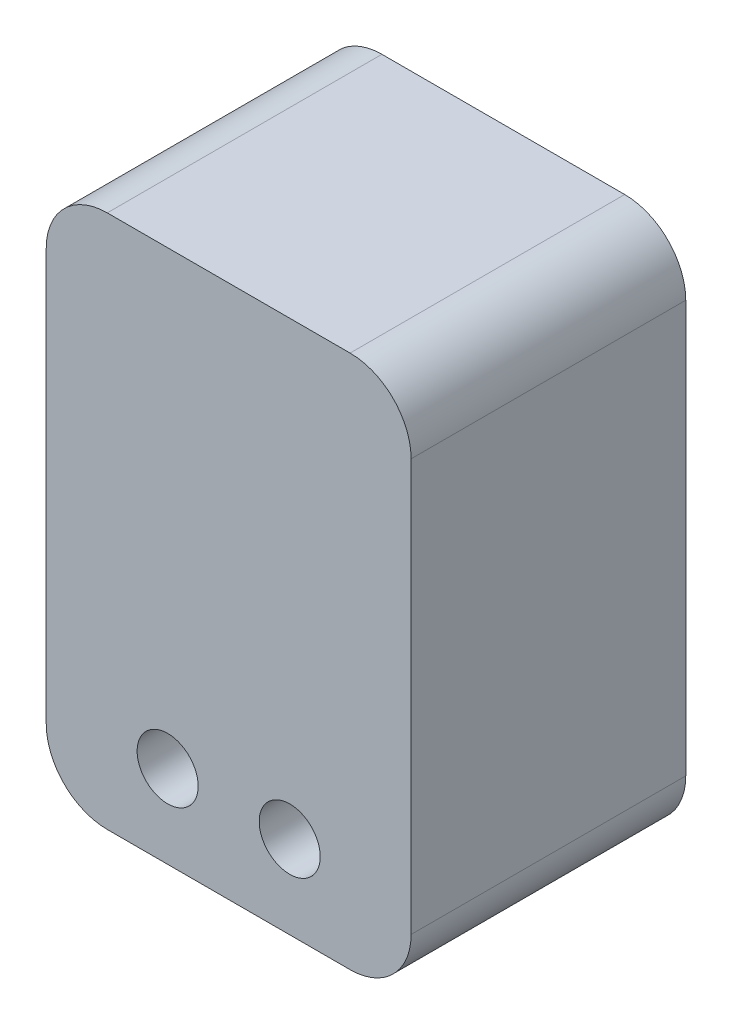
ISO-10303-21;
HEADER;
FILE_DESCRIPTION(('STEP AP214'),'2;1');
FILE_NAME('part.step','',(''),(''),'','','');
FILE_SCHEMA(('AUTOMOTIVE_DESIGN { 1 0 10303 214 1 1 1 1 }'));
ENDSEC;
DATA;
#1=APPLICATION_CONTEXT('core data for automotive mechanical design processes');
#2=APPLICATION_PROTOCOL_DEFINITION('international standard','automotive_design',2000,#1);
#3=PRODUCT_CONTEXT('',#1,'mechanical');
#4=PRODUCT('Part','Part','',(#3));
#5=PRODUCT_RELATED_PRODUCT_CATEGORY('part','',(#4));
#6=PRODUCT_DEFINITION_FORMATION('','',#4);
#7=PRODUCT_DEFINITION_CONTEXT('part definition',#1,'design');
#8=PRODUCT_DEFINITION('design','',#6,#7);
#9=PRODUCT_DEFINITION_SHAPE('','',#8);
#10=(LENGTH_UNIT() NAMED_UNIT(*) SI_UNIT(.MILLI.,.METRE.));
#11=(NAMED_UNIT(*) PLANE_ANGLE_UNIT() SI_UNIT($,.RADIAN.));
#12=(NAMED_UNIT(*) SI_UNIT($,.STERADIAN.) SOLID_ANGLE_UNIT());
#13=UNCERTAINTY_MEASURE_WITH_UNIT(LENGTH_MEASURE(1.E-05),#10,'distance_accuracy_value','');
#14=(GEOMETRIC_REPRESENTATION_CONTEXT(3) GLOBAL_UNCERTAINTY_ASSIGNED_CONTEXT((#13)) GLOBAL_UNIT_ASSIGNED_CONTEXT((#10,
#11,#12)) REPRESENTATION_CONTEXT('',''));
#15=CARTESIAN_POINT('',(0.,0.,0.));
#16=DIRECTION('',(0.,0.,1.));
#17=DIRECTION('',(1.,0.,0.));
#18=AXIS2_PLACEMENT_3D('',#15,#16,#17);
#19=CARTESIAN_POINT('',(0.,0.,9.));
#20=DIRECTION('',(0.,0.,1.));
#21=DIRECTION('',(1.,0.,0.));
#22=AXIS2_PLACEMENT_3D('',#19,#20,#21);
#23=PLANE('',#22);
#24=CARTESIAN_POINT('',(-2.,-6.03236787400678,9.));
#25=DIRECTION('',(0.,0.,1.));
#26=DIRECTION('',(1.,0.,0.));
#27=AXIS2_PLACEMENT_3D('',#24,#25,#26);
#28=CIRCLE('',#27,1.);
#29=CARTESIAN_POINT('',(-1.,-6.03236787400678,9.));
#30=VERTEX_POINT('',#29);
#31=EDGE_CURVE('E151',#30,#30,#28,.T.);
#32=ORIENTED_EDGE('',*,*,#31,.F.);
#33=EDGE_LOOP('',(#32));
#34=FACE_BOUND('',#33,.T.);
#35=DIRECTION('',(0.,1.,0.));
#36=VECTOR('',#35,1.);
#37=CARTESIAN_POINT('',(5.97879067718509,8.75,9.));
#38=LINE('',#37,#36);
#39=CARTESIAN_POINT('',(5.97879067718509,-6.75,9.));
#40=VERTEX_POINT('',#39);
#41=CARTESIAN_POINT('',(5.97879067718509,6.75,9.));
#42=VERTEX_POINT('',#41);
#43=EDGE_CURVE('E157',#40,#42,#38,.T.);
#44=ORIENTED_EDGE('',*,*,#43,.T.);
#45=CARTESIAN_POINT('',(3.97879067718509,6.75,9.));
#46=DIRECTION('',(0.,0.,1.));
#47=DIRECTION('',(1.,0.,0.));
#48=AXIS2_PLACEMENT_3D('',#45,#46,#47);
#49=CIRCLE('',#48,2.);
#50=CARTESIAN_POINT('',(3.97879067718509,8.75,9.));
#51=VERTEX_POINT('',#50);
#52=EDGE_CURVE('E181',#42,#51,#49,.T.);
#53=ORIENTED_EDGE('',*,*,#52,.T.);
#54=DIRECTION('',(-1.,0.,0.));
#55=VECTOR('',#54,1.);
#56=CARTESIAN_POINT('',(-5.97879067718509,8.75,9.));
#57=LINE('',#56,#55);
#58=CARTESIAN_POINT('',(-3.97879067718509,8.75,9.));
#59=VERTEX_POINT('',#58);
#60=EDGE_CURVE('E134',#51,#59,#57,.T.);
#61=ORIENTED_EDGE('',*,*,#60,.T.);
#62=CARTESIAN_POINT('',(-3.97879067718509,6.75,9.));
#63=DIRECTION('',(0.,0.,1.));
#64=DIRECTION('',(1.,0.,0.));
#65=AXIS2_PLACEMENT_3D('',#62,#63,#64);
#66=CIRCLE('',#65,2.);
#67=CARTESIAN_POINT('',(-5.97879067718509,6.75,9.));
#68=VERTEX_POINT('',#67);
#69=EDGE_CURVE('E173',#59,#68,#66,.T.);
#70=ORIENTED_EDGE('',*,*,#69,.T.);
#71=DIRECTION('',(0.,-1.,0.));
#72=VECTOR('',#71,1.);
#73=CARTESIAN_POINT('',(-5.97879067718509,8.75,9.));
#74=LINE('',#73,#72);
#75=CARTESIAN_POINT('',(-5.97879067718509,-6.75,9.));
#76=VERTEX_POINT('',#75);
#77=EDGE_CURVE('E196',#68,#76,#74,.T.);
#78=ORIENTED_EDGE('',*,*,#77,.T.);
#79=CARTESIAN_POINT('',(-3.97879067718509,-6.75,9.));
#80=DIRECTION('',(0.,0.,1.));
#81=DIRECTION('',(1.,0.,0.));
#82=AXIS2_PLACEMENT_3D('',#79,#80,#81);
#83=CIRCLE('',#82,2.);
#84=CARTESIAN_POINT('',(-3.97879067718509,-8.75,9.));
#85=VERTEX_POINT('',#84);
#86=EDGE_CURVE('E69',#76,#85,#83,.T.);
#87=ORIENTED_EDGE('',*,*,#86,.T.);
#88=DIRECTION('',(1.,0.,0.));
#89=VECTOR('',#88,1.);
#90=CARTESIAN_POINT('',(-5.97879067718509,-8.75,9.));
#91=LINE('',#90,#89);
#92=CARTESIAN_POINT('',(3.97879067718509,-8.75,9.));
#93=VERTEX_POINT('',#92);
#94=EDGE_CURVE('E159',#85,#93,#91,.T.);
#95=ORIENTED_EDGE('',*,*,#94,.T.);
#96=CARTESIAN_POINT('',(3.97879067718509,-6.75,9.));
#97=DIRECTION('',(0.,0.,1.));
#98=DIRECTION('',(1.,0.,0.));
#99=AXIS2_PLACEMENT_3D('',#96,#97,#98);
#100=CIRCLE('',#99,2.);
#101=EDGE_CURVE('E178',#93,#40,#100,.T.);
#102=ORIENTED_EDGE('',*,*,#101,.T.);
#103=EDGE_LOOP('',(#44,#53,#61,#70,#78,#87,#95,#102));
#104=FACE_BOUND('',#103,.T.);
#105=CARTESIAN_POINT('',(2.,-6.03236787400678,9.));
#106=DIRECTION('',(0.,0.,1.));
#107=DIRECTION('',(1.,0.,0.));
#108=AXIS2_PLACEMENT_3D('',#105,#106,#107);
#109=CIRCLE('',#108,1.);
#110=CARTESIAN_POINT('',(3.,-6.03236787400678,9.));
#111=VERTEX_POINT('',#110);
#112=EDGE_CURVE('E218',#111,#111,#109,.T.);
#113=ORIENTED_EDGE('',*,*,#112,.F.);
#114=EDGE_LOOP('',(#113));
#115=FACE_BOUND('',#114,.T.);
#116=ADVANCED_FACE('F46',(#34,#104,#115),#23,.T.);
#117=CARTESIAN_POINT('',(0.,0.,0.));
#118=DIRECTION('',(0.,0.,1.));
#119=DIRECTION('',(1.,0.,0.));
#120=AXIS2_PLACEMENT_3D('',#117,#118,#119);
#121=PLANE('',#120);
#122=DIRECTION('',(-1.,0.,0.));
#123=VECTOR('',#122,1.);
#124=CARTESIAN_POINT('',(-5.97879067718509,8.75,0.));
#125=LINE('',#124,#123);
#126=CARTESIAN_POINT('',(3.97879067718509,8.75,0.));
#127=VERTEX_POINT('',#126);
#128=CARTESIAN_POINT('',(-3.97879067718509,8.75,0.));
#129=VERTEX_POINT('',#128);
#130=EDGE_CURVE('E131',#127,#129,#125,.T.);
#131=ORIENTED_EDGE('',*,*,#130,.F.);
#132=CARTESIAN_POINT('',(3.97879067718509,6.75,0.));
#133=DIRECTION('',(0.,0.,1.));
#134=DIRECTION('',(1.,0.,0.));
#135=AXIS2_PLACEMENT_3D('',#132,#133,#134);
#136=CIRCLE('',#135,2.);
#137=CARTESIAN_POINT('',(5.97879067718509,6.75,0.));
#138=VERTEX_POINT('',#137);
#139=EDGE_CURVE('E113',#127,#138,#136,.F.);
#140=ORIENTED_EDGE('',*,*,#139,.T.);
#141=DIRECTION('',(0.,1.,0.));
#142=VECTOR('',#141,1.);
#143=CARTESIAN_POINT('',(5.97879067718509,8.75,0.));
#144=LINE('',#143,#142);
#145=CARTESIAN_POINT('',(5.97879067718509,-6.75,0.));
#146=VERTEX_POINT('',#145);
#147=EDGE_CURVE('E144',#146,#138,#144,.T.);
#148=ORIENTED_EDGE('',*,*,#147,.F.);
#149=CARTESIAN_POINT('',(3.97879067718509,-6.75,0.));
#150=DIRECTION('',(0.,0.,1.));
#151=DIRECTION('',(1.,0.,0.));
#152=AXIS2_PLACEMENT_3D('',#149,#150,#151);
#153=CIRCLE('',#152,2.);
#154=CARTESIAN_POINT('',(3.97879067718509,-8.75,0.));
#155=VERTEX_POINT('',#154);
#156=EDGE_CURVE('E125',#146,#155,#153,.F.);
#157=ORIENTED_EDGE('',*,*,#156,.T.);
#158=DIRECTION('',(1.,0.,0.));
#159=VECTOR('',#158,1.);
#160=CARTESIAN_POINT('',(-5.97879067718509,-8.75,0.));
#161=LINE('',#160,#159);
#162=CARTESIAN_POINT('',(-3.97879067718509,-8.75,0.));
#163=VERTEX_POINT('',#162);
#164=EDGE_CURVE('E149',#163,#155,#161,.T.);
#165=ORIENTED_EDGE('',*,*,#164,.F.);
#166=CARTESIAN_POINT('',(-3.97879067718509,-6.75,0.));
#167=DIRECTION('',(0.,0.,1.));
#168=DIRECTION('',(1.,0.,0.));
#169=AXIS2_PLACEMENT_3D('',#166,#167,#168);
#170=CIRCLE('',#169,2.);
#171=CARTESIAN_POINT('',(-5.97879067718509,-6.75,0.));
#172=VERTEX_POINT('',#171);
#173=EDGE_CURVE('E163',#163,#172,#170,.F.);
#174=ORIENTED_EDGE('',*,*,#173,.T.);
#175=DIRECTION('',(0.,-1.,0.));
#176=VECTOR('',#175,1.);
#177=CARTESIAN_POINT('',(-5.97879067718509,8.75,0.));
#178=LINE('',#177,#176);
#179=CARTESIAN_POINT('',(-5.97879067718509,6.75,0.));
#180=VERTEX_POINT('',#179);
#181=EDGE_CURVE('E143',#180,#172,#178,.T.);
#182=ORIENTED_EDGE('',*,*,#181,.F.);
#183=CARTESIAN_POINT('',(-3.97879067718509,6.75,0.));
#184=DIRECTION('',(0.,0.,1.));
#185=DIRECTION('',(1.,0.,0.));
#186=AXIS2_PLACEMENT_3D('',#183,#184,#185);
#187=CIRCLE('',#186,2.);
#188=EDGE_CURVE('E136',#180,#129,#187,.F.);
#189=ORIENTED_EDGE('',*,*,#188,.T.);
#190=EDGE_LOOP('',(#131,#140,#148,#157,#165,#174,#182,#189));
#191=FACE_BOUND('',#190,.T.);
#192=CARTESIAN_POINT('',(-2.,-6.03236787400678,0.));
#193=DIRECTION('',(0.,0.,1.));
#194=DIRECTION('',(1.,0.,0.));
#195=AXIS2_PLACEMENT_3D('',#192,#193,#194);
#196=CIRCLE('',#195,1.);
#197=CARTESIAN_POINT('',(-1.,-6.03236787400678,0.));
#198=VERTEX_POINT('',#197);
#199=EDGE_CURVE('E214',#198,#198,#196,.T.);
#200=ORIENTED_EDGE('',*,*,#199,.T.);
#201=EDGE_LOOP('',(#200));
#202=FACE_BOUND('',#201,.T.);
#203=CARTESIAN_POINT('',(2.,-6.03236787400678,0.));
#204=DIRECTION('',(0.,0.,1.));
#205=DIRECTION('',(1.,0.,0.));
#206=AXIS2_PLACEMENT_3D('',#203,#204,#205);
#207=CIRCLE('',#206,1.);
#208=CARTESIAN_POINT('',(3.,-6.03236787400678,0.));
#209=VERTEX_POINT('',#208);
#210=EDGE_CURVE('E222',#209,#209,#207,.T.);
#211=ORIENTED_EDGE('',*,*,#210,.T.);
#212=EDGE_LOOP('',(#211));
#213=FACE_BOUND('',#212,.T.);
#214=ADVANCED_FACE('F139',(#191,#202,#213),#121,.F.);
#215=CARTESIAN_POINT('',(5.97879067718509,8.75,9.));
#216=DIRECTION('',(-1.,0.,0.));
#217=DIRECTION('',(0.,-1.,0.));
#218=AXIS2_PLACEMENT_3D('',#215,#216,#217);
#219=PLANE('',#218);
#220=ORIENTED_EDGE('',*,*,#147,.T.);
#221=DIRECTION('',(0.,0.,-1.));
#222=VECTOR('',#221,1.);
#223=CARTESIAN_POINT('',(5.97879067718509,6.75,9.));
#224=LINE('',#223,#222);
#225=EDGE_CURVE('E118',#138,#42,#224,.F.);
#226=ORIENTED_EDGE('',*,*,#225,.T.);
#227=ORIENTED_EDGE('',*,*,#43,.F.);
#228=DIRECTION('',(0.,0.,-1.));
#229=VECTOR('',#228,1.);
#230=CARTESIAN_POINT('',(5.97879067718509,-6.75,9.));
#231=LINE('',#230,#229);
#232=EDGE_CURVE('E124',#40,#146,#231,.T.);
#233=ORIENTED_EDGE('',*,*,#232,.T.);
#234=EDGE_LOOP('',(#220,#226,#227,#233));
#235=FACE_BOUND('',#234,.T.);
#236=ADVANCED_FACE('F269',(#235),#219,.F.);
#237=CARTESIAN_POINT('',(-5.97879067718509,8.75,9.));
#238=DIRECTION('',(0.,-1.,0.));
#239=DIRECTION('',(0.,0.,-1.));
#240=AXIS2_PLACEMENT_3D('',#237,#238,#239);
#241=PLANE('',#240);
#242=ORIENTED_EDGE('',*,*,#60,.F.);
#243=DIRECTION('',(0.,0.,-1.));
#244=VECTOR('',#243,1.);
#245=CARTESIAN_POINT('',(3.97879067718509,8.75,9.));
#246=LINE('',#245,#244);
#247=EDGE_CURVE('E117',#51,#127,#246,.T.);
#248=ORIENTED_EDGE('',*,*,#247,.T.);
#249=ORIENTED_EDGE('',*,*,#130,.T.);
#250=DIRECTION('',(0.,0.,-1.));
#251=VECTOR('',#250,1.);
#252=CARTESIAN_POINT('',(-3.97879067718509,8.75,9.));
#253=LINE('',#252,#251);
#254=EDGE_CURVE('E137',#129,#59,#253,.F.);
#255=ORIENTED_EDGE('',*,*,#254,.T.);
#256=EDGE_LOOP('',(#242,#248,#249,#255));
#257=FACE_BOUND('',#256,.T.);
#258=ADVANCED_FACE('F130',(#257),#241,.F.);
#259=CARTESIAN_POINT('',(-5.97879067718509,8.75,9.));
#260=DIRECTION('',(1.,0.,0.));
#261=DIRECTION('',(0.,1.,0.));
#262=AXIS2_PLACEMENT_3D('',#259,#260,#261);
#263=PLANE('',#262);
#264=ORIENTED_EDGE('',*,*,#181,.T.);
#265=DIRECTION('',(0.,0.,-1.));
#266=VECTOR('',#265,1.);
#267=CARTESIAN_POINT('',(-5.97879067718509,-6.75,9.));
#268=LINE('',#267,#266);
#269=EDGE_CURVE('E11',#172,#76,#268,.F.);
#270=ORIENTED_EDGE('',*,*,#269,.T.);
#271=ORIENTED_EDGE('',*,*,#77,.F.);
#272=DIRECTION('',(0.,0.,-1.));
#273=VECTOR('',#272,1.);
#274=CARTESIAN_POINT('',(-5.97879067718509,6.75,9.));
#275=LINE('',#274,#273);
#276=EDGE_CURVE('E55',#68,#180,#275,.T.);
#277=ORIENTED_EDGE('',*,*,#276,.T.);
#278=EDGE_LOOP('',(#264,#270,#271,#277));
#279=FACE_BOUND('',#278,.T.);
#280=ADVANCED_FACE('F194',(#279),#263,.F.);
#281=CARTESIAN_POINT('',(-5.97879067718509,-8.75,9.));
#282=DIRECTION('',(0.,1.,0.));
#283=DIRECTION('',(0.,0.,1.));
#284=AXIS2_PLACEMENT_3D('',#281,#282,#283);
#285=PLANE('',#284);
#286=ORIENTED_EDGE('',*,*,#164,.T.);
#287=DIRECTION('',(0.,0.,-1.));
#288=VECTOR('',#287,1.);
#289=CARTESIAN_POINT('',(3.97879067718509,-8.75,9.));
#290=LINE('',#289,#288);
#291=EDGE_CURVE('E62',#155,#93,#290,.F.);
#292=ORIENTED_EDGE('',*,*,#291,.T.);
#293=ORIENTED_EDGE('',*,*,#94,.F.);
#294=DIRECTION('',(0.,0.,-1.));
#295=VECTOR('',#294,1.);
#296=CARTESIAN_POINT('',(-3.97879067718509,-8.75,9.));
#297=LINE('',#296,#295);
#298=EDGE_CURVE('E184',#85,#163,#297,.T.);
#299=ORIENTED_EDGE('',*,*,#298,.T.);
#300=EDGE_LOOP('',(#286,#292,#293,#299));
#301=FACE_BOUND('',#300,.T.);
#302=ADVANCED_FACE('F203',(#301),#285,.F.);
#303=CARTESIAN_POINT('',(-2.,-6.03236787400678,9.));
#304=DIRECTION('',(0.,0.,-1.));
#305=DIRECTION('',(-1.,0.,0.));
#306=AXIS2_PLACEMENT_3D('',#303,#304,#305);
#307=CYLINDRICAL_SURFACE('',#306,1.);
#308=ORIENTED_EDGE('',*,*,#31,.T.);
#309=EDGE_LOOP('',(#308));
#310=FACE_BOUND('',#309,.T.);
#311=ORIENTED_EDGE('',*,*,#199,.F.);
#312=EDGE_LOOP('',(#311));
#313=FACE_BOUND('',#312,.T.);
#314=ADVANCED_FACE('F260',(#310,#313),#307,.F.);
#315=CARTESIAN_POINT('',(2.,-6.03236787400678,9.));
#316=DIRECTION('',(0.,0.,-1.));
#317=DIRECTION('',(-1.,0.,0.));
#318=AXIS2_PLACEMENT_3D('',#315,#316,#317);
#319=CYLINDRICAL_SURFACE('',#318,1.);
#320=ORIENTED_EDGE('',*,*,#112,.T.);
#321=EDGE_LOOP('',(#320));
#322=FACE_BOUND('',#321,.T.);
#323=ORIENTED_EDGE('',*,*,#210,.F.);
#324=EDGE_LOOP('',(#323));
#325=FACE_BOUND('',#324,.T.);
#326=ADVANCED_FACE('F257',(#322,#325),#319,.F.);
#327=CARTESIAN_POINT('',(3.97879067718509,6.75,9.));
#328=DIRECTION('',(0.,0.,-1.));
#329=DIRECTION('',(-1.,0.,0.));
#330=AXIS2_PLACEMENT_3D('',#327,#328,#329);
#331=CYLINDRICAL_SURFACE('',#330,2.);
#332=ORIENTED_EDGE('',*,*,#52,.F.);
#333=ORIENTED_EDGE('',*,*,#225,.F.);
#334=ORIENTED_EDGE('',*,*,#139,.F.);
#335=ORIENTED_EDGE('',*,*,#247,.F.);
#336=EDGE_LOOP('',(#332,#333,#334,#335));
#337=FACE_BOUND('',#336,.T.);
#338=ADVANCED_FACE('F116',(#337),#331,.T.);
#339=CARTESIAN_POINT('',(3.97879067718509,-6.75,9.));
#340=DIRECTION('',(0.,0.,-1.));
#341=DIRECTION('',(-1.,0.,0.));
#342=AXIS2_PLACEMENT_3D('',#339,#340,#341);
#343=CYLINDRICAL_SURFACE('',#342,2.);
#344=ORIENTED_EDGE('',*,*,#101,.F.);
#345=ORIENTED_EDGE('',*,*,#291,.F.);
#346=ORIENTED_EDGE('',*,*,#156,.F.);
#347=ORIENTED_EDGE('',*,*,#232,.F.);
#348=EDGE_LOOP('',(#344,#345,#346,#347));
#349=FACE_BOUND('',#348,.T.);
#350=ADVANCED_FACE('F281',(#349),#343,.T.);
#351=CARTESIAN_POINT('',(-3.97879067718509,-6.75,9.));
#352=DIRECTION('',(0.,0.,-1.));
#353=DIRECTION('',(-1.,0.,0.));
#354=AXIS2_PLACEMENT_3D('',#351,#352,#353);
#355=CYLINDRICAL_SURFACE('',#354,2.);
#356=ORIENTED_EDGE('',*,*,#86,.F.);
#357=ORIENTED_EDGE('',*,*,#269,.F.);
#358=ORIENTED_EDGE('',*,*,#173,.F.);
#359=ORIENTED_EDGE('',*,*,#298,.F.);
#360=EDGE_LOOP('',(#356,#357,#358,#359));
#361=FACE_BOUND('',#360,.T.);
#362=ADVANCED_FACE('F202',(#361),#355,.T.);
#363=CARTESIAN_POINT('',(-3.97879067718509,6.75,9.));
#364=DIRECTION('',(0.,0.,-1.));
#365=DIRECTION('',(-1.,0.,0.));
#366=AXIS2_PLACEMENT_3D('',#363,#364,#365);
#367=CYLINDRICAL_SURFACE('',#366,2.);
#368=ORIENTED_EDGE('',*,*,#69,.F.);
#369=ORIENTED_EDGE('',*,*,#254,.F.);
#370=ORIENTED_EDGE('',*,*,#188,.F.);
#371=ORIENTED_EDGE('',*,*,#276,.F.);
#372=EDGE_LOOP('',(#368,#369,#370,#371));
#373=FACE_BOUND('',#372,.T.);
#374=ADVANCED_FACE('F48',(#373),#367,.T.);
#375=CLOSED_SHELL('',(#116,#214,#236,#258,#280,#302,#314,#326,#338,#350,#362,#374));
#376=CARTESIAN_POINT('',(0.,3.05,4.49999999999999));
#377=DIRECTION('',(0.,1.,0.));
#378=DIRECTION('',(0.,0.,1.));
#379=AXIS2_PLACEMENT_3D('',#376,#377,#378);
#380=CYLINDRICAL_SURFACE('',#379,3.5);
#381=CARTESIAN_POINT('',(0.,3.05,4.49999999999999));
#382=DIRECTION('',(0.,1.,0.));
#383=DIRECTION('',(0.,0.,1.));
#384=AXIS2_PLACEMENT_3D('',#381,#382,#383);
#385=CIRCLE('',#384,3.5);
#386=CARTESIAN_POINT('',(0.,3.05,7.99999999999999));
#387=VERTEX_POINT('',#386);
#388=EDGE_CURVE('E226',#387,#387,#385,.T.);
#389=ORIENTED_EDGE('',*,*,#388,.F.);
#390=EDGE_LOOP('',(#389));
#391=FACE_BOUND('',#390,.T.);
#392=CARTESIAN_POINT('',(0.,6.75,4.49999999999999));
#393=DIRECTION('',(0.,1.,0.));
#394=DIRECTION('',(0.,0.,1.));
#395=AXIS2_PLACEMENT_3D('',#392,#393,#394);
#396=CIRCLE('',#395,3.5);
#397=CARTESIAN_POINT('',(0.,6.75,7.99999999999999));
#398=VERTEX_POINT('',#397);
#399=EDGE_CURVE('E230',#398,#398,#396,.T.);
#400=ORIENTED_EDGE('',*,*,#399,.T.);
#401=EDGE_LOOP('',(#400));
#402=FACE_BOUND('',#401,.T.);
#403=ADVANCED_FACE('F240',(#391,#402),#380,.F.);
#404=CARTESIAN_POINT('',(0.,3.05,4.49999999999999));
#405=DIRECTION('',(0.,1.,0.));
#406=DIRECTION('',(0.,0.,1.));
#407=AXIS2_PLACEMENT_3D('',#404,#405,#406);
#408=PLANE('',#407);
#409=ORIENTED_EDGE('',*,*,#388,.T.);
#410=EDGE_LOOP('',(#409));
#411=FACE_BOUND('',#410,.T.);
#412=ADVANCED_FACE('F238',(#411),#408,.T.);
#413=CARTESIAN_POINT('',(0.,6.75,4.49999999999999));
#414=DIRECTION('',(0.,1.,0.));
#415=DIRECTION('',(0.,0.,1.));
#416=AXIS2_PLACEMENT_3D('',#413,#414,#415);
#417=PLANE('',#416);
#418=ORIENTED_EDGE('',*,*,#399,.F.);
#419=EDGE_LOOP('',(#418));
#420=FACE_BOUND('',#419,.T.);
#421=ADVANCED_FACE('F247',(#420),#417,.F.);
#422=CLOSED_SHELL('',(#403,#412,#421));
#423=ORIENTED_CLOSED_SHELL('',*,#422,.T.);
#424=BREP_WITH_VOIDS('B2',#375,(#423));
#425=ADVANCED_BREP_SHAPE_REPRESENTATION('',(#18,#424),#14);
#426=SHAPE_DEFINITION_REPRESENTATION(#9,#425);
ENDSEC;
END-ISO-10303-21;
